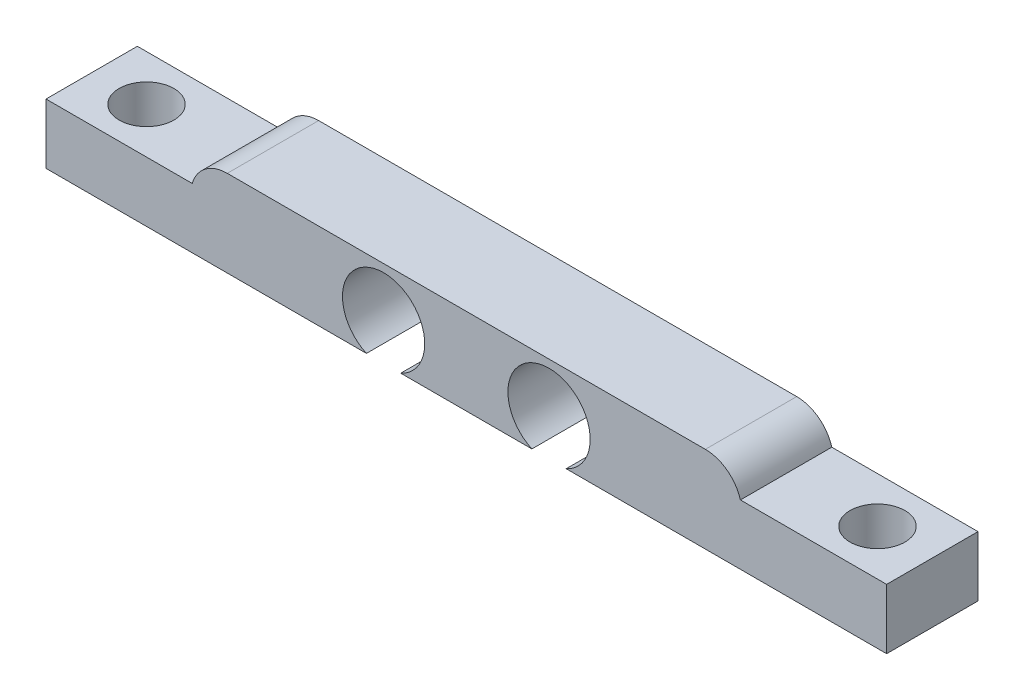
ISO-10303-21;
HEADER;
FILE_DESCRIPTION(('STEP AP214'),'2;1');
FILE_NAME('part.step','',(''),(''),'','','');
FILE_SCHEMA(('AUTOMOTIVE_DESIGN { 1 0 10303 214 1 1 1 1 }'));
ENDSEC;
DATA;
#1=APPLICATION_CONTEXT('core data for automotive mechanical design processes');
#2=APPLICATION_PROTOCOL_DEFINITION('international standard','automotive_design',2000,#1);
#3=PRODUCT_CONTEXT('',#1,'mechanical');
#4=PRODUCT('Part','Part','',(#3));
#5=PRODUCT_RELATED_PRODUCT_CATEGORY('part','',(#4));
#6=PRODUCT_DEFINITION_FORMATION('','',#4);
#7=PRODUCT_DEFINITION_CONTEXT('part definition',#1,'design');
#8=PRODUCT_DEFINITION('design','',#6,#7);
#9=PRODUCT_DEFINITION_SHAPE('','',#8);
#10=(LENGTH_UNIT() NAMED_UNIT(*) SI_UNIT(.MILLI.,.METRE.));
#11=(NAMED_UNIT(*) PLANE_ANGLE_UNIT() SI_UNIT($,.RADIAN.));
#12=(NAMED_UNIT(*) SI_UNIT($,.STERADIAN.) SOLID_ANGLE_UNIT());
#13=UNCERTAINTY_MEASURE_WITH_UNIT(LENGTH_MEASURE(1.E-05),#10,'distance_accuracy_value','');
#14=(GEOMETRIC_REPRESENTATION_CONTEXT(3) GLOBAL_UNCERTAINTY_ASSIGNED_CONTEXT((#13)) GLOBAL_UNIT_ASSIGNED_CONTEXT((#10,
#11,#12)) REPRESENTATION_CONTEXT('',''));
#15=CARTESIAN_POINT('',(0.,0.,0.));
#16=DIRECTION('',(0.,0.,1.));
#17=DIRECTION('',(1.,0.,0.));
#18=AXIS2_PLACEMENT_3D('',#15,#16,#17);
#19=CARTESIAN_POINT('',(0.,0.,-5.));
#20=DIRECTION('',(0.,-1.,0.));
#21=DIRECTION('',(0.,0.,-1.));
#22=AXIS2_PLACEMENT_3D('',#19,#20,#21);
#23=PLANE('',#22);
#24=DIRECTION('',(0.,0.,1.));
#25=VECTOR('',#24,1.);
#26=CARTESIAN_POINT('',(15.4650106053107,0.,-5.));
#27=LINE('',#26,#25);
#28=CARTESIAN_POINT('',(15.4650106053107,0.,-5.));
#29=VERTEX_POINT('',#28);
#30=CARTESIAN_POINT('',(15.4650106053107,0.,0.));
#31=VERTEX_POINT('',#30);
#32=EDGE_CURVE('E49',#29,#31,#27,.T.);
#33=ORIENTED_EDGE('',*,*,#32,.F.);
#34=DIRECTION('',(1.,0.,0.));
#35=VECTOR('',#34,1.);
#36=CARTESIAN_POINT('',(0.,0.,-5.));
#37=LINE('',#36,#35);
#38=CARTESIAN_POINT('',(33.,0.,-5.));
#39=VERTEX_POINT('',#38);
#40=EDGE_CURVE('E147',#29,#39,#37,.T.);
#41=ORIENTED_EDGE('',*,*,#40,.T.);
#42=DIRECTION('',(0.,0.,1.));
#43=VECTOR('',#42,1.);
#44=CARTESIAN_POINT('',(33.,0.,-5.));
#45=LINE('',#44,#43);
#46=CARTESIAN_POINT('',(33.,0.,0.));
#47=VERTEX_POINT('',#46);
#48=EDGE_CURVE('E207',#39,#47,#45,.T.);
#49=ORIENTED_EDGE('',*,*,#48,.T.);
#50=DIRECTION('',(1.,0.,0.));
#51=VECTOR('',#50,1.);
#52=CARTESIAN_POINT('',(0.,0.,0.));
#53=LINE('',#52,#51);
#54=EDGE_CURVE('E187',#31,#47,#53,.T.);
#55=ORIENTED_EDGE('',*,*,#54,.F.);
#56=EDGE_LOOP('',(#33,#41,#49,#55));
#57=FACE_BOUND('',#56,.T.);
#58=CARTESIAN_POINT('',(30.,0.,-2.49999999999981));
#59=DIRECTION('',(0.,1.,0.));
#60=DIRECTION('',(-1.,0.,0.));
#61=AXIS2_PLACEMENT_3D('',#58,#59,#60);
#62=CIRCLE('',#61,1.5);
#63=CARTESIAN_POINT('',(28.5,0.,-2.49999999999981));
#64=VERTEX_POINT('',#63);
#65=EDGE_CURVE('E168',#64,#64,#62,.T.);
#66=ORIENTED_EDGE('',*,*,#65,.T.);
#67=EDGE_LOOP('',(#66));
#68=FACE_BOUND('',#67,.T.);
#69=ADVANCED_FACE('F35',(#57,#68),#23,.T.);
#70=DIRECTION('',(0.,0.,1.));
#71=VECTOR('',#70,1.);
#72=CARTESIAN_POINT('',(13.5892413260869,0.,-5.));
#73=LINE('',#72,#71);
#74=CARTESIAN_POINT('',(13.5892413260869,0.,0.));
#75=VERTEX_POINT('',#74);
#76=CARTESIAN_POINT('',(13.5892413260869,0.,-5.));
#77=VERTEX_POINT('',#76);
#78=EDGE_CURVE('E175',#75,#77,#73,.F.);
#79=ORIENTED_EDGE('',*,*,#78,.F.);
#80=CARTESIAN_POINT('',(6.4107586739131,0.,0.));
#81=VERTEX_POINT('',#80);
#82=EDGE_CURVE('E184',#81,#75,#53,.T.);
#83=ORIENTED_EDGE('',*,*,#82,.F.);
#84=DIRECTION('',(0.,0.,1.));
#85=VECTOR('',#84,1.);
#86=CARTESIAN_POINT('',(6.4107586739131,0.,-5.));
#87=LINE('',#86,#85);
#88=CARTESIAN_POINT('',(6.4107586739131,0.,-5.));
#89=VERTEX_POINT('',#88);
#90=EDGE_CURVE('E57',#89,#81,#87,.T.);
#91=ORIENTED_EDGE('',*,*,#90,.F.);
#92=EDGE_CURVE('E139',#89,#77,#37,.T.);
#93=ORIENTED_EDGE('',*,*,#92,.T.);
#94=EDGE_LOOP('',(#79,#83,#91,#93));
#95=FACE_BOUND('',#94,.T.);
#96=ADVANCED_FACE('F181',(#95),#23,.T.);
#97=CARTESIAN_POINT('',(0.,4.72725515068389,-5.));
#98=DIRECTION('',(0.,-1.,0.));
#99=DIRECTION('',(1.,0.,0.));
#100=AXIS2_PLACEMENT_3D('',#97,#98,#99);
#101=PLANE('',#100);
#102=DIRECTION('',(1.,0.,0.));
#103=VECTOR('',#102,1.);
#104=CARTESIAN_POINT('',(0.,4.72725515068389,-5.));
#105=LINE('',#104,#103);
#106=CARTESIAN_POINT('',(-3.08022614612744,4.72725515068389,-5.));
#107=VERTEX_POINT('',#106);
#108=CARTESIAN_POINT('',(23.0802261461274,4.72725515068389,-5.));
#109=VERTEX_POINT('',#108);
#110=EDGE_CURVE('E215',#107,#109,#105,.T.);
#111=ORIENTED_EDGE('',*,*,#110,.F.);
#112=DIRECTION('',(0.,0.,1.));
#113=VECTOR('',#112,1.);
#114=CARTESIAN_POINT('',(-3.08022614612744,4.72725515068389,-5.));
#115=LINE('',#114,#113);
#116=CARTESIAN_POINT('',(-3.08022614612744,4.72725515068389,0.));
#117=VERTEX_POINT('',#116);
#118=EDGE_CURVE('E217',#107,#117,#115,.T.);
#119=ORIENTED_EDGE('',*,*,#118,.T.);
#120=DIRECTION('',(1.,0.,0.));
#121=VECTOR('',#120,1.);
#122=CARTESIAN_POINT('',(0.,4.72725515068389,0.));
#123=LINE('',#122,#121);
#124=CARTESIAN_POINT('',(23.0802261461274,4.72725515068389,0.));
#125=VERTEX_POINT('',#124);
#126=EDGE_CURVE('E160',#117,#125,#123,.T.);
#127=ORIENTED_EDGE('',*,*,#126,.T.);
#128=DIRECTION('',(0.,0.,-1.));
#129=VECTOR('',#128,1.);
#130=CARTESIAN_POINT('',(23.0802261461274,4.72725515068389,-5.));
#131=LINE('',#130,#129);
#132=EDGE_CURVE('E204',#125,#109,#131,.T.);
#133=ORIENTED_EDGE('',*,*,#132,.T.);
#134=EDGE_LOOP('',(#111,#119,#127,#133));
#135=FACE_BOUND('',#134,.T.);
#136=ADVANCED_FACE('F251',(#135),#101,.F.);
#137=CARTESIAN_POINT('',(0.,3.28802992720946,-5.));
#138=DIRECTION('',(0.,-1.,0.));
#139=DIRECTION('',(0.,0.,-1.));
#140=AXIS2_PLACEMENT_3D('',#137,#138,#139);
#141=PLANE('',#140);
#142=CARTESIAN_POINT('',(30.,3.28802992720946,-2.49999999999981));
#143=DIRECTION('',(0.,-1.,0.));
#144=DIRECTION('',(0.,0.,-1.));
#145=AXIS2_PLACEMENT_3D('',#142,#143,#144);
#146=CIRCLE('',#145,1.5);
#147=CARTESIAN_POINT('',(28.5,3.28802992720946,-2.49999999999981));
#148=VERTEX_POINT('',#147);
#149=EDGE_CURVE('E163',#148,#148,#146,.T.);
#150=ORIENTED_EDGE('',*,*,#149,.T.);
#151=EDGE_LOOP('',(#150));
#152=FACE_BOUND('',#151,.T.);
#153=DIRECTION('',(1.,0.,0.));
#154=VECTOR('',#153,1.);
#155=CARTESIAN_POINT('',(0.,3.28802992720946,0.));
#156=LINE('',#155,#154);
#157=CARTESIAN_POINT('',(25.,3.28802992720946,0.));
#158=VERTEX_POINT('',#157);
#159=CARTESIAN_POINT('',(33.,3.28802992720946,0.));
#160=VERTEX_POINT('',#159);
#161=EDGE_CURVE('E196',#158,#160,#156,.T.);
#162=ORIENTED_EDGE('',*,*,#161,.T.);
#163=DIRECTION('',(0.,0.,1.));
#164=VECTOR('',#163,1.);
#165=CARTESIAN_POINT('',(33.,3.28802992720946,-5.));
#166=LINE('',#165,#164);
#167=CARTESIAN_POINT('',(33.,3.28802992720946,-5.));
#168=VERTEX_POINT('',#167);
#169=EDGE_CURVE('E205',#168,#160,#166,.T.);
#170=ORIENTED_EDGE('',*,*,#169,.F.);
#171=DIRECTION('',(1.,0.,0.));
#172=VECTOR('',#171,1.);
#173=CARTESIAN_POINT('',(0.,3.28802992720946,-5.));
#174=LINE('',#173,#172);
#175=CARTESIAN_POINT('',(25.,3.28802992720946,-5.));
#176=VERTEX_POINT('',#175);
#177=EDGE_CURVE('E149',#176,#168,#174,.T.);
#178=ORIENTED_EDGE('',*,*,#177,.F.);
#179=DIRECTION('',(0.,0.,1.));
#180=VECTOR('',#179,1.);
#181=CARTESIAN_POINT('',(25.,3.28802992720946,-5.));
#182=LINE('',#181,#180);
#183=EDGE_CURVE('E201',#176,#158,#182,.T.);
#184=ORIENTED_EDGE('',*,*,#183,.T.);
#185=EDGE_LOOP('',(#162,#170,#178,#184));
#186=FACE_BOUND('',#185,.T.);
#187=ADVANCED_FACE('F260',(#152,#186),#141,.F.);
#188=CARTESIAN_POINT('',(33.,0.,-5.));
#189=DIRECTION('',(1.,0.,0.));
#190=DIRECTION('',(0.,0.,-1.));
#191=AXIS2_PLACEMENT_3D('',#188,#189,#190);
#192=PLANE('',#191);
#193=DIRECTION('',(0.,1.,0.));
#194=VECTOR('',#193,1.);
#195=CARTESIAN_POINT('',(33.,0.,0.));
#196=LINE('',#195,#194);
#197=EDGE_CURVE('E189',#47,#160,#196,.T.);
#198=ORIENTED_EDGE('',*,*,#197,.F.);
#199=ORIENTED_EDGE('',*,*,#48,.F.);
#200=DIRECTION('',(0.,1.,0.));
#201=VECTOR('',#200,1.);
#202=CARTESIAN_POINT('',(33.,0.,-5.));
#203=LINE('',#202,#201);
#204=EDGE_CURVE('E145',#39,#168,#203,.T.);
#205=ORIENTED_EDGE('',*,*,#204,.T.);
#206=ORIENTED_EDGE('',*,*,#169,.T.);
#207=EDGE_LOOP('',(#198,#199,#205,#206));
#208=FACE_BOUND('',#207,.T.);
#209=ADVANCED_FACE('F264',(#208),#192,.T.);
#210=DIRECTION('',(0.,0.,1.));
#211=VECTOR('',#210,1.);
#212=CARTESIAN_POINT('',(4.53498939468935,0.,-5.));
#213=LINE('',#212,#211);
#214=CARTESIAN_POINT('',(4.53498939468935,0.,0.));
#215=VERTEX_POINT('',#214);
#216=CARTESIAN_POINT('',(4.53498939468935,0.,-5.));
#217=VERTEX_POINT('',#216);
#218=EDGE_CURVE('E121',#215,#217,#213,.F.);
#219=ORIENTED_EDGE('',*,*,#218,.F.);
#220=CARTESIAN_POINT('',(-13.,0.,0.));
#221=VERTEX_POINT('',#220);
#222=EDGE_CURVE('E186',#221,#215,#53,.T.);
#223=ORIENTED_EDGE('',*,*,#222,.F.);
#224=DIRECTION('',(0.,0.,1.));
#225=VECTOR('',#224,1.);
#226=CARTESIAN_POINT('',(-13.,0.,-5.));
#227=LINE('',#226,#225);
#228=CARTESIAN_POINT('',(-13.,0.,-5.));
#229=VERTEX_POINT('',#228);
#230=EDGE_CURVE('E143',#229,#221,#227,.T.);
#231=ORIENTED_EDGE('',*,*,#230,.F.);
#232=EDGE_CURVE('E136',#229,#217,#37,.T.);
#233=ORIENTED_EDGE('',*,*,#232,.T.);
#234=EDGE_LOOP('',(#219,#223,#231,#233));
#235=FACE_BOUND('',#234,.T.);
#236=CARTESIAN_POINT('',(-10.,0.,-2.49999999999981));
#237=DIRECTION('',(0.,1.,0.));
#238=DIRECTION('',(-1.,0.,0.));
#239=AXIS2_PLACEMENT_3D('',#236,#237,#238);
#240=CIRCLE('',#239,1.5);
#241=CARTESIAN_POINT('',(-11.5,0.,-2.49999999999981));
#242=VERTEX_POINT('',#241);
#243=EDGE_CURVE('E171',#242,#242,#240,.T.);
#244=ORIENTED_EDGE('',*,*,#243,.T.);
#245=EDGE_LOOP('',(#244));
#246=FACE_BOUND('',#245,.T.);
#247=ADVANCED_FACE('F141',(#235,#246),#23,.T.);
#248=CARTESIAN_POINT('',(-13.,0.,-5.));
#249=DIRECTION('',(1.,0.,0.));
#250=DIRECTION('',(0.,0.,-1.));
#251=AXIS2_PLACEMENT_3D('',#248,#249,#250);
#252=PLANE('',#251);
#253=DIRECTION('',(0.,1.,0.));
#254=VECTOR('',#253,1.);
#255=CARTESIAN_POINT('',(-13.,0.,0.));
#256=LINE('',#255,#254);
#257=CARTESIAN_POINT('',(-13.,3.28802992720946,0.));
#258=VERTEX_POINT('',#257);
#259=EDGE_CURVE('E190',#221,#258,#256,.T.);
#260=ORIENTED_EDGE('',*,*,#259,.T.);
#261=DIRECTION('',(0.,0.,1.));
#262=VECTOR('',#261,1.);
#263=CARTESIAN_POINT('',(-13.,3.28802992720946,-5.));
#264=LINE('',#263,#262);
#265=CARTESIAN_POINT('',(-13.,3.28802992720946,-5.));
#266=VERTEX_POINT('',#265);
#267=EDGE_CURVE('E210',#266,#258,#264,.T.);
#268=ORIENTED_EDGE('',*,*,#267,.F.);
#269=DIRECTION('',(0.,1.,0.));
#270=VECTOR('',#269,1.);
#271=CARTESIAN_POINT('',(-13.,0.,-5.));
#272=LINE('',#271,#270);
#273=EDGE_CURVE('E152',#229,#266,#272,.T.);
#274=ORIENTED_EDGE('',*,*,#273,.F.);
#275=ORIENTED_EDGE('',*,*,#230,.T.);
#276=EDGE_LOOP('',(#260,#268,#274,#275));
#277=FACE_BOUND('',#276,.T.);
#278=ADVANCED_FACE('F237',(#277),#252,.F.);
#279=CARTESIAN_POINT('',(0.,3.28802992720946,-5.));
#280=DIRECTION('',(0.,1.,0.));
#281=DIRECTION('',(-1.,0.,0.));
#282=AXIS2_PLACEMENT_3D('',#279,#280,#281);
#283=PLANE('',#282);
#284=CARTESIAN_POINT('',(-10.,3.28802992720946,-2.49999999999981));
#285=DIRECTION('',(0.,1.,0.));
#286=DIRECTION('',(-1.,0.,0.));
#287=AXIS2_PLACEMENT_3D('',#284,#285,#286);
#288=CIRCLE('',#287,1.5);
#289=CARTESIAN_POINT('',(-11.5,3.28802992720946,-2.49999999999981));
#290=VERTEX_POINT('',#289);
#291=EDGE_CURVE('E167',#290,#290,#288,.T.);
#292=ORIENTED_EDGE('',*,*,#291,.F.);
#293=EDGE_LOOP('',(#292));
#294=FACE_BOUND('',#293,.T.);
#295=DIRECTION('',(-1.,0.,0.));
#296=VECTOR('',#295,1.);
#297=CARTESIAN_POINT('',(0.,3.28802992720946,0.));
#298=LINE('',#297,#296);
#299=CARTESIAN_POINT('',(-5.,3.28802992720946,0.));
#300=VERTEX_POINT('',#299);
#301=EDGE_CURVE('E166',#300,#258,#298,.T.);
#302=ORIENTED_EDGE('',*,*,#301,.F.);
#303=DIRECTION('',(0.,0.,1.));
#304=VECTOR('',#303,1.);
#305=CARTESIAN_POINT('',(-5.,3.28802992720946,-5.));
#306=LINE('',#305,#304);
#307=CARTESIAN_POINT('',(-5.,3.28802992720946,-5.));
#308=VERTEX_POINT('',#307);
#309=EDGE_CURVE('E212',#308,#300,#306,.T.);
#310=ORIENTED_EDGE('',*,*,#309,.F.);
#311=DIRECTION('',(-1.,0.,0.));
#312=VECTOR('',#311,1.);
#313=CARTESIAN_POINT('',(0.,3.28802992720946,-5.));
#314=LINE('',#313,#312);
#315=EDGE_CURVE('E156',#308,#266,#314,.T.);
#316=ORIENTED_EDGE('',*,*,#315,.T.);
#317=ORIENTED_EDGE('',*,*,#267,.T.);
#318=EDGE_LOOP('',(#302,#310,#316,#317));
#319=FACE_BOUND('',#318,.T.);
#320=ADVANCED_FACE('F234',(#294,#319),#283,.T.);
#321=CARTESIAN_POINT('',(0.,0.,-5.));
#322=DIRECTION('',(0.,0.,1.));
#323=DIRECTION('',(1.,0.,0.));
#324=AXIS2_PLACEMENT_3D('',#321,#322,#323);
#325=PLANE('',#324);
#326=ORIENTED_EDGE('',*,*,#40,.F.);
#327=CARTESIAN_POINT('',(14.5271259656988,2.04520717844919,-5.));
#328=DIRECTION('',(0.,0.,1.));
#329=DIRECTION('',(1.,0.,0.));
#330=AXIS2_PLACEMENT_3D('',#327,#328,#329);
#331=CIRCLE('',#330,2.25);
#332=EDGE_CURVE('E129',#29,#77,#331,.T.);
#333=ORIENTED_EDGE('',*,*,#332,.T.);
#334=ORIENTED_EDGE('',*,*,#92,.F.);
#335=CARTESIAN_POINT('',(5.47287403430122,2.04520717844919,-5.));
#336=DIRECTION('',(0.,0.,1.));
#337=DIRECTION('',(-1.,0.,0.));
#338=AXIS2_PLACEMENT_3D('',#335,#336,#337);
#339=CIRCLE('',#338,2.25);
#340=EDGE_CURVE('E124',#89,#217,#339,.T.);
#341=ORIENTED_EDGE('',*,*,#340,.T.);
#342=ORIENTED_EDGE('',*,*,#232,.F.);
#343=ORIENTED_EDGE('',*,*,#273,.T.);
#344=ORIENTED_EDGE('',*,*,#315,.F.);
#345=CARTESIAN_POINT('',(-3.08022614612744,2.72725515068389,-5.));
#346=DIRECTION('',(0.,0.,1.));
#347=DIRECTION('',(1.,0.,0.));
#348=AXIS2_PLACEMENT_3D('',#345,#346,#347);
#349=CIRCLE('',#348,2.);
#350=EDGE_CURVE('E226',#308,#107,#349,.F.);
#351=ORIENTED_EDGE('',*,*,#350,.T.);
#352=ORIENTED_EDGE('',*,*,#110,.T.);
#353=CARTESIAN_POINT('',(23.0802261461274,2.72725515068389,-5.));
#354=DIRECTION('',(0.,0.,1.));
#355=DIRECTION('',(1.,0.,0.));
#356=AXIS2_PLACEMENT_3D('',#353,#354,#355);
#357=CIRCLE('',#356,2.);
#358=EDGE_CURVE('E224',#109,#176,#357,.F.);
#359=ORIENTED_EDGE('',*,*,#358,.T.);
#360=ORIENTED_EDGE('',*,*,#177,.T.);
#361=ORIENTED_EDGE('',*,*,#204,.F.);
#362=EDGE_LOOP('',(#326,#333,#334,#341,#342,#343,#344,#351,#352,#359,#360,#361));
#363=FACE_BOUND('',#362,.T.);
#364=ADVANCED_FACE('F135',(#363),#325,.F.);
#365=CARTESIAN_POINT('',(0.,0.,0.));
#366=DIRECTION('',(0.,0.,1.));
#367=DIRECTION('',(1.,0.,0.));
#368=AXIS2_PLACEMENT_3D('',#365,#366,#367);
#369=PLANE('',#368);
#370=CARTESIAN_POINT('',(14.5271259656988,2.04520717844919,0.));
#371=DIRECTION('',(0.,0.,1.));
#372=DIRECTION('',(1.,0.,0.));
#373=AXIS2_PLACEMENT_3D('',#370,#371,#372);
#374=CIRCLE('',#373,2.25);
#375=EDGE_CURVE('E11',#31,#75,#374,.T.);
#376=ORIENTED_EDGE('',*,*,#375,.F.);
#377=ORIENTED_EDGE('',*,*,#54,.T.);
#378=ORIENTED_EDGE('',*,*,#197,.T.);
#379=ORIENTED_EDGE('',*,*,#161,.F.);
#380=CARTESIAN_POINT('',(23.0802261461274,2.72725515068389,0.));
#381=DIRECTION('',(0.,0.,1.));
#382=DIRECTION('',(1.,0.,0.));
#383=AXIS2_PLACEMENT_3D('',#380,#381,#382);
#384=CIRCLE('',#383,2.);
#385=EDGE_CURVE('E220',#158,#125,#384,.T.);
#386=ORIENTED_EDGE('',*,*,#385,.T.);
#387=ORIENTED_EDGE('',*,*,#126,.F.);
#388=CARTESIAN_POINT('',(-3.08022614612744,2.72725515068389,0.));
#389=DIRECTION('',(0.,0.,1.));
#390=DIRECTION('',(1.,0.,0.));
#391=AXIS2_PLACEMENT_3D('',#388,#389,#390);
#392=CIRCLE('',#391,2.);
#393=EDGE_CURVE('E222',#117,#300,#392,.T.);
#394=ORIENTED_EDGE('',*,*,#393,.T.);
#395=ORIENTED_EDGE('',*,*,#301,.T.);
#396=ORIENTED_EDGE('',*,*,#259,.F.);
#397=ORIENTED_EDGE('',*,*,#222,.T.);
#398=CARTESIAN_POINT('',(5.47287403430122,2.04520717844919,0.));
#399=DIRECTION('',(0.,0.,1.));
#400=DIRECTION('',(1.,0.,0.));
#401=AXIS2_PLACEMENT_3D('',#398,#399,#400);
#402=CIRCLE('',#401,2.25);
#403=EDGE_CURVE('E43',#81,#215,#402,.T.);
#404=ORIENTED_EDGE('',*,*,#403,.F.);
#405=ORIENTED_EDGE('',*,*,#82,.T.);
#406=EDGE_LOOP('',(#376,#377,#378,#379,#386,#387,#394,#395,#396,#397,#404,#405));
#407=FACE_BOUND('',#406,.T.);
#408=ADVANCED_FACE('F267',(#407),#369,.T.);
#409=CARTESIAN_POINT('',(-3.08022614612744,2.72725515068389,-5.));
#410=DIRECTION('',(0.,0.,1.));
#411=DIRECTION('',(1.,0.,0.));
#412=AXIS2_PLACEMENT_3D('',#409,#410,#411);
#413=CYLINDRICAL_SURFACE('',#412,2.);
#414=ORIENTED_EDGE('',*,*,#350,.F.);
#415=ORIENTED_EDGE('',*,*,#309,.T.);
#416=ORIENTED_EDGE('',*,*,#393,.F.);
#417=ORIENTED_EDGE('',*,*,#118,.F.);
#418=EDGE_LOOP('',(#414,#415,#416,#417));
#419=FACE_BOUND('',#418,.T.);
#420=ADVANCED_FACE('F245',(#419),#413,.T.);
#421=CARTESIAN_POINT('',(23.0802261461274,2.72725515068389,-5.));
#422=DIRECTION('',(0.,0.,-1.));
#423=DIRECTION('',(-1.,0.,0.));
#424=AXIS2_PLACEMENT_3D('',#421,#422,#423);
#425=CYLINDRICAL_SURFACE('',#424,2.);
#426=ORIENTED_EDGE('',*,*,#358,.F.);
#427=ORIENTED_EDGE('',*,*,#132,.F.);
#428=ORIENTED_EDGE('',*,*,#385,.F.);
#429=ORIENTED_EDGE('',*,*,#183,.F.);
#430=EDGE_LOOP('',(#426,#427,#428,#429));
#431=FACE_BOUND('',#430,.T.);
#432=ADVANCED_FACE('F37',(#431),#425,.T.);
#433=CARTESIAN_POINT('',(-10.,0.,-2.49999999999981));
#434=DIRECTION('',(0.,1.,0.));
#435=DIRECTION('',(-1.,0.,0.));
#436=AXIS2_PLACEMENT_3D('',#433,#434,#435);
#437=CYLINDRICAL_SURFACE('',#436,1.5);
#438=CARTESIAN_POINT('',(-11.5,3.28802992720946,-2.49999999999981));
#439=CARTESIAN_POINT('',(-11.5,3.25377961546769,-2.49999999999981));
#440=CARTESIAN_POINT('',(-11.5,3.21952930372593,-2.49999999999981));
#441=CARTESIAN_POINT('',(-11.5,3.1510286802424,-2.49999999999981));
#442=CARTESIAN_POINT('',(-11.5,3.11677836850063,-2.49999999999981));
#443=CARTESIAN_POINT('',(-11.5,3.0482777450171,-2.49999999999981));
#444=CARTESIAN_POINT('',(-11.5,3.01402743327534,-2.49999999999981));
#445=CARTESIAN_POINT('',(-11.5,2.94552680979181,-2.49999999999981));
#446=CARTESIAN_POINT('',(-11.5,2.91127649805004,-2.49999999999981));
#447=CARTESIAN_POINT('',(-11.5,2.84277587456651,-2.49999999999981));
#448=CARTESIAN_POINT('',(-11.5,2.80852556282474,-2.49999999999981));
#449=CARTESIAN_POINT('',(-11.5,2.74002493934121,-2.49999999999981));
#450=CARTESIAN_POINT('',(-11.5,2.70577462759945,-2.49999999999981));
#451=CARTESIAN_POINT('',(-11.5,2.63727400411592,-2.49999999999981));
#452=CARTESIAN_POINT('',(-11.5,2.60302369237415,-2.49999999999981));
#453=CARTESIAN_POINT('',(-11.5,2.53452306889062,-2.49999999999981));
#454=CARTESIAN_POINT('',(-11.5,2.50027275714886,-2.49999999999981));
#455=CARTESIAN_POINT('',(-11.5,2.43177213366533,-2.49999999999981));
#456=CARTESIAN_POINT('',(-11.5,2.39752182192356,-2.49999999999981));
#457=CARTESIAN_POINT('',(-11.5,2.32902119844003,-2.49999999999981));
#458=CARTESIAN_POINT('',(-11.5,2.29477088669826,-2.49999999999981));
#459=CARTESIAN_POINT('',(-11.5,2.22627026321473,-2.49999999999981));
#460=CARTESIAN_POINT('',(-11.5,2.19201995147297,-2.49999999999981));
#461=CARTESIAN_POINT('',(-11.5,2.12351932798944,-2.49999999999981));
#462=CARTESIAN_POINT('',(-11.5,2.08926901624767,-2.49999999999981));
#463=CARTESIAN_POINT('',(-11.5,2.02076839276414,-2.49999999999981));
#464=CARTESIAN_POINT('',(-11.5,1.98651808102238,-2.49999999999981));
#465=CARTESIAN_POINT('',(-11.5,1.91801745753885,-2.49999999999981));
#466=CARTESIAN_POINT('',(-11.5,1.88376714579708,-2.49999999999981));
#467=CARTESIAN_POINT('',(-11.5,1.81526652231355,-2.49999999999981));
#468=CARTESIAN_POINT('',(-11.5,1.78101621057179,-2.49999999999981));
#469=CARTESIAN_POINT('',(-11.5,1.71251558708825,-2.49999999999981));
#470=CARTESIAN_POINT('',(-11.5,1.67826527534649,-2.49999999999981));
#471=CARTESIAN_POINT('',(-11.5,1.60976465186296,-2.49999999999981));
#472=CARTESIAN_POINT('',(-11.5,1.57551434012119,-2.49999999999981));
#473=CARTESIAN_POINT('',(-11.5,1.50701371663766,-2.49999999999981));
#474=CARTESIAN_POINT('',(-11.5,1.4727634048959,-2.49999999999981));
#475=CARTESIAN_POINT('',(-11.5,1.40426278141237,-2.49999999999981));
#476=CARTESIAN_POINT('',(-11.5,1.3700124696706,-2.49999999999981));
#477=CARTESIAN_POINT('',(-11.5,1.30151184618707,-2.49999999999981));
#478=CARTESIAN_POINT('',(-11.5,1.26726153444531,-2.49999999999981));
#479=CARTESIAN_POINT('',(-11.5,1.19876091096178,-2.49999999999981));
#480=CARTESIAN_POINT('',(-11.5,1.16451059922001,-2.49999999999981));
#481=CARTESIAN_POINT('',(-11.5,1.09600997573648,-2.49999999999981));
#482=CARTESIAN_POINT('',(-11.5,1.06175966399471,-2.49999999999981));
#483=CARTESIAN_POINT('',(-11.5,0.993259040511184,-2.49999999999981));
#484=CARTESIAN_POINT('',(-11.5,0.959008728769418,-2.49999999999981));
#485=CARTESIAN_POINT('',(-11.5,0.890508105285888,-2.49999999999981));
#486=CARTESIAN_POINT('',(-11.5,0.856257793544122,-2.49999999999981));
#487=CARTESIAN_POINT('',(-11.5,0.787757170060592,-2.49999999999981));
#488=CARTESIAN_POINT('',(-11.5,0.753506858318826,-2.49999999999981));
#489=CARTESIAN_POINT('',(-11.5,0.685006234835296,-2.49999999999981));
#490=CARTESIAN_POINT('',(-11.5,0.650755923093531,-2.49999999999981));
#491=CARTESIAN_POINT('',(-11.5,0.58225529961,-2.49999999999981));
#492=CARTESIAN_POINT('',(-11.5,0.548004987868235,-2.49999999999981));
#493=CARTESIAN_POINT('',(-11.5,0.479504364384704,-2.49999999999981));
#494=CARTESIAN_POINT('',(-11.5,0.445254052642939,-2.49999999999981));
#495=CARTESIAN_POINT('',(-11.5,0.376753429159408,-2.49999999999981));
#496=CARTESIAN_POINT('',(-11.5,0.342503117417643,-2.49999999999981));
#497=CARTESIAN_POINT('',(-11.5,0.274002493934113,-2.49999999999981));
#498=CARTESIAN_POINT('',(-11.5,0.239752182192347,-2.49999999999981));
#499=CARTESIAN_POINT('',(-11.5,0.171251558708817,-2.49999999999981));
#500=CARTESIAN_POINT('',(-11.5,0.137001246967051,-2.49999999999981));
#501=CARTESIAN_POINT('',(-11.5,0.0685006234835209,-2.49999999999981));
#502=CARTESIAN_POINT('',(-11.5,0.0342503117417555,-2.49999999999981));
#503=CARTESIAN_POINT('',(-11.5,0.,-2.49999999999981));
#504=B_SPLINE_CURVE_WITH_KNOTS('',3,(#438,#439,#440,#441,#442,#443,#444,#445,#446,#447,#448,
#449,#450,#451,#452,#453,#454,#455,#456,#457,#458,#459,#460,#461,#462,#463,#464,#465,#466,#467,
#468,#469,#470,#471,#472,#473,#474,#475,#476,#477,#478,#479,#480,#481,#482,#483,#484,#485,#486,
#487,#488,#489,#490,#491,#492,#493,#494,#495,#496,#497,#498,#499,#500,#501,#502,#503),
.UNSPECIFIED.,.F.,.F.,(4,2,2,2,2,2,2,2,2,2,2,2,2,2,2,2,2,2,2,2,2,2,2,2,2,2,2,2,2,2,2,2,4),(0.,
0.102750935225296,0.205501870450592,0.308252805675888,0.411003740901183,0.513754676126479,
0.616505611351776,0.719256546577071,0.822007481802367,0.924758417027663,1.02750935225296,
1.13026028747825,1.23301122270355,1.33576215792885,1.43851309315414,1.54126402837944,
1.64401496360473,1.74676589883003,1.84951683405533,1.95226776928062,2.05501870450592,
2.15776963973121,2.26052057495651,2.3632715101818,2.4660224454071,2.5687733806324,
2.67152431585769,2.77427525108299,2.87702618630828,2.97977712153358,3.08252805675888,
3.18527899198417,3.28802992720947),.UNSPECIFIED.);
#505=EDGE_CURVE('BSEAM231',#290,#242,#504,.T.);
#506=ORIENTED_EDGE('',*,*,#291,.T.);
#507=ORIENTED_EDGE('',*,*,#243,.F.);
#508=ORIENTED_EDGE('',*,*,#505,.T.);
#509=ORIENTED_EDGE('',*,*,#505,.F.);
#510=EDGE_LOOP('',(#506,#508,#507,#509));
#511=FACE_BOUND('',#510,.T.);
#512=ADVANCED_FACE('F231',(#511),#437,.F.);
#513=CARTESIAN_POINT('',(30.,0.,-2.49999999999981));
#514=DIRECTION('',(0.,1.,0.));
#515=DIRECTION('',(-1.,0.,0.));
#516=AXIS2_PLACEMENT_3D('',#513,#514,#515);
#517=CYLINDRICAL_SURFACE('',#516,1.5);
#518=CARTESIAN_POINT('',(28.5,0.,-2.49999999999981));
#519=CARTESIAN_POINT('',(28.5,0.0342503117417628,-2.49999999999981));
#520=CARTESIAN_POINT('',(28.5,0.068500623483528,-2.49999999999981));
#521=CARTESIAN_POINT('',(28.5,0.137001246967059,-2.49999999999981));
#522=CARTESIAN_POINT('',(28.5,0.171251558708824,-2.49999999999981));
#523=CARTESIAN_POINT('',(28.5,0.239752182192354,-2.49999999999981));
#524=CARTESIAN_POINT('',(28.5,0.274002493934119,-2.49999999999981));
#525=CARTESIAN_POINT('',(28.5,0.34250311741765,-2.49999999999981));
#526=CARTESIAN_POINT('',(28.5,0.376753429159415,-2.49999999999981));
#527=CARTESIAN_POINT('',(28.5,0.445254052642946,-2.49999999999981));
#528=CARTESIAN_POINT('',(28.5,0.479504364384711,-2.49999999999981));
#529=CARTESIAN_POINT('',(28.5,0.548004987868241,-2.49999999999981));
#530=CARTESIAN_POINT('',(28.5,0.582255299610007,-2.49999999999981));
#531=CARTESIAN_POINT('',(28.5,0.650755923093537,-2.49999999999981));
#532=CARTESIAN_POINT('',(28.5,0.685006234835302,-2.49999999999981));
#533=CARTESIAN_POINT('',(28.5,0.753506858318833,-2.49999999999981));
#534=CARTESIAN_POINT('',(28.5,0.787757170060598,-2.49999999999981));
#535=CARTESIAN_POINT('',(28.5,0.856257793544128,-2.49999999999981));
#536=CARTESIAN_POINT('',(28.5,0.890508105285894,-2.49999999999981));
#537=CARTESIAN_POINT('',(28.5,0.959008728769424,-2.49999999999981));
#538=CARTESIAN_POINT('',(28.5,0.99325904051119,-2.49999999999981));
#539=CARTESIAN_POINT('',(28.5,1.06175966399472,-2.49999999999981));
#540=CARTESIAN_POINT('',(28.5,1.09600997573649,-2.49999999999981));
#541=CARTESIAN_POINT('',(28.5,1.16451059922002,-2.49999999999981));
#542=CARTESIAN_POINT('',(28.5,1.19876091096178,-2.49999999999981));
#543=CARTESIAN_POINT('',(28.5,1.26726153444531,-2.49999999999981));
#544=CARTESIAN_POINT('',(28.5,1.30151184618708,-2.49999999999981));
#545=CARTESIAN_POINT('',(28.5,1.37001246967061,-2.49999999999981));
#546=CARTESIAN_POINT('',(28.5,1.40426278141237,-2.49999999999981));
#547=CARTESIAN_POINT('',(28.5,1.4727634048959,-2.49999999999981));
#548=CARTESIAN_POINT('',(28.5,1.50701371663767,-2.49999999999981));
#549=CARTESIAN_POINT('',(28.5,1.5755143401212,-2.49999999999981));
#550=CARTESIAN_POINT('',(28.5,1.60976465186296,-2.49999999999981));
#551=CARTESIAN_POINT('',(28.5,1.67826527534649,-2.49999999999981));
#552=CARTESIAN_POINT('',(28.5,1.71251558708826,-2.49999999999981));
#553=CARTESIAN_POINT('',(28.5,1.78101621057179,-2.49999999999981));
#554=CARTESIAN_POINT('',(28.5,1.81526652231356,-2.49999999999981));
#555=CARTESIAN_POINT('',(28.5,1.88376714579709,-2.49999999999981));
#556=CARTESIAN_POINT('',(28.5,1.91801745753885,-2.49999999999981));
#557=CARTESIAN_POINT('',(28.5,1.98651808102238,-2.49999999999981));
#558=CARTESIAN_POINT('',(28.5,2.02076839276415,-2.49999999999981));
#559=CARTESIAN_POINT('',(28.5,2.08926901624768,-2.49999999999981));
#560=CARTESIAN_POINT('',(28.5,2.12351932798944,-2.49999999999981));
#561=CARTESIAN_POINT('',(28.5,2.19201995147297,-2.49999999999981));
#562=CARTESIAN_POINT('',(28.5,2.22627026321474,-2.49999999999981));
#563=CARTESIAN_POINT('',(28.5,2.29477088669827,-2.49999999999981));
#564=CARTESIAN_POINT('',(28.5,2.32902119844003,-2.49999999999981));
#565=CARTESIAN_POINT('',(28.5,2.39752182192356,-2.49999999999981));
#566=CARTESIAN_POINT('',(28.5,2.43177213366533,-2.49999999999981));
#567=CARTESIAN_POINT('',(28.5,2.50027275714886,-2.49999999999981));
#568=CARTESIAN_POINT('',(28.5,2.53452306889062,-2.49999999999981));
#569=CARTESIAN_POINT('',(28.5,2.60302369237416,-2.49999999999981));
#570=CARTESIAN_POINT('',(28.5,2.63727400411592,-2.49999999999981));
#571=CARTESIAN_POINT('',(28.5,2.70577462759945,-2.49999999999981));
#572=CARTESIAN_POINT('',(28.5,2.74002493934122,-2.49999999999981));
#573=CARTESIAN_POINT('',(28.5,2.80852556282475,-2.49999999999981));
#574=CARTESIAN_POINT('',(28.5,2.84277587456651,-2.49999999999981));
#575=CARTESIAN_POINT('',(28.5,2.91127649805004,-2.49999999999981));
#576=CARTESIAN_POINT('',(28.5,2.94552680979181,-2.49999999999981));
#577=CARTESIAN_POINT('',(28.5,3.01402743327534,-2.49999999999981));
#578=CARTESIAN_POINT('',(28.5,3.0482777450171,-2.49999999999981));
#579=CARTESIAN_POINT('',(28.5,3.11677836850063,-2.49999999999981));
#580=CARTESIAN_POINT('',(28.5,3.1510286802424,-2.49999999999981));
#581=CARTESIAN_POINT('',(28.5,3.21952930372593,-2.49999999999981));
#582=CARTESIAN_POINT('',(28.5,3.2537796154677,-2.49999999999981));
#583=CARTESIAN_POINT('',(28.5,3.28802992720946,-2.49999999999981));
#584=B_SPLINE_CURVE_WITH_KNOTS('',3,(#518,#519,#520,#521,#522,#523,#524,#525,#526,#527,#528,
#529,#530,#531,#532,#533,#534,#535,#536,#537,#538,#539,#540,#541,#542,#543,#544,#545,#546,#547,
#548,#549,#550,#551,#552,#553,#554,#555,#556,#557,#558,#559,#560,#561,#562,#563,#564,#565,#566,
#567,#568,#569,#570,#571,#572,#573,#574,#575,#576,#577,#578,#579,#580,#581,#582,#583),
.UNSPECIFIED.,.F.,.F.,(4,2,2,2,2,2,2,2,2,2,2,2,2,2,2,2,2,2,2,2,2,2,2,2,2,2,2,2,2,2,2,2,4),(0.,
0.102750935225296,0.205501870450591,0.308252805675887,0.411003740901183,0.513754676126479,
0.616505611351774,0.71925654657707,0.822007481802366,0.924758417027661,1.02750935225296,
1.13026028747825,1.23301122270355,1.33576215792884,1.43851309315414,1.54126402837944,
1.64401496360473,1.74676589883003,1.84951683405532,1.95226776928062,2.05501870450591,
2.15776963973121,2.26052057495651,2.3632715101818,2.4660224454071,2.56877338063239,
2.67152431585769,2.77427525108298,2.87702618630828,2.97977712153358,3.08252805675887,
3.18527899198417,3.28802992720946),.UNSPECIFIED.);
#585=EDGE_CURVE('BSEAM274',#64,#148,#584,.T.);
#586=ORIENTED_EDGE('',*,*,#65,.F.);
#587=ORIENTED_EDGE('',*,*,#149,.F.);
#588=ORIENTED_EDGE('',*,*,#585,.T.);
#589=ORIENTED_EDGE('',*,*,#585,.F.);
#590=EDGE_LOOP('',(#586,#588,#587,#589));
#591=FACE_BOUND('',#590,.T.);
#592=ADVANCED_FACE('F274',(#591),#517,.F.);
#593=CARTESIAN_POINT('',(5.47287403430122,2.04520717844919,-5.));
#594=DIRECTION('',(0.,0.,1.));
#595=DIRECTION('',(1.,0.,0.));
#596=AXIS2_PLACEMENT_3D('',#593,#594,#595);
#597=CYLINDRICAL_SURFACE('',#596,2.25);
#598=ORIENTED_EDGE('',*,*,#90,.T.);
#599=ORIENTED_EDGE('',*,*,#403,.T.);
#600=ORIENTED_EDGE('',*,*,#218,.T.);
#601=ORIENTED_EDGE('',*,*,#340,.F.);
#602=EDGE_LOOP('',(#598,#599,#600,#601));
#603=FACE_BOUND('',#602,.T.);
#604=ADVANCED_FACE('F123',(#603),#597,.F.);
#605=CARTESIAN_POINT('',(14.5271259656988,2.04520717844919,-5.));
#606=DIRECTION('',(0.,0.,1.));
#607=DIRECTION('',(1.,0.,0.));
#608=AXIS2_PLACEMENT_3D('',#605,#606,#607);
#609=CYLINDRICAL_SURFACE('',#608,2.25);
#610=ORIENTED_EDGE('',*,*,#32,.T.);
#611=ORIENTED_EDGE('',*,*,#375,.T.);
#612=ORIENTED_EDGE('',*,*,#78,.T.);
#613=ORIENTED_EDGE('',*,*,#332,.F.);
#614=EDGE_LOOP('',(#610,#611,#612,#613));
#615=FACE_BOUND('',#614,.T.);
#616=ADVANCED_FACE('F268',(#615),#609,.F.);
#617=CLOSED_SHELL('',(#69,#96,#136,#187,#209,#247,#278,#320,#364,#408,#420,#432,#512,#592,#604,#616));
#618=MANIFOLD_SOLID_BREP('B2',#617);
#619=ADVANCED_BREP_SHAPE_REPRESENTATION('',(#18,#618),#14);
#620=SHAPE_DEFINITION_REPRESENTATION(#9,#619);
ENDSEC;
END-ISO-10303-21;
